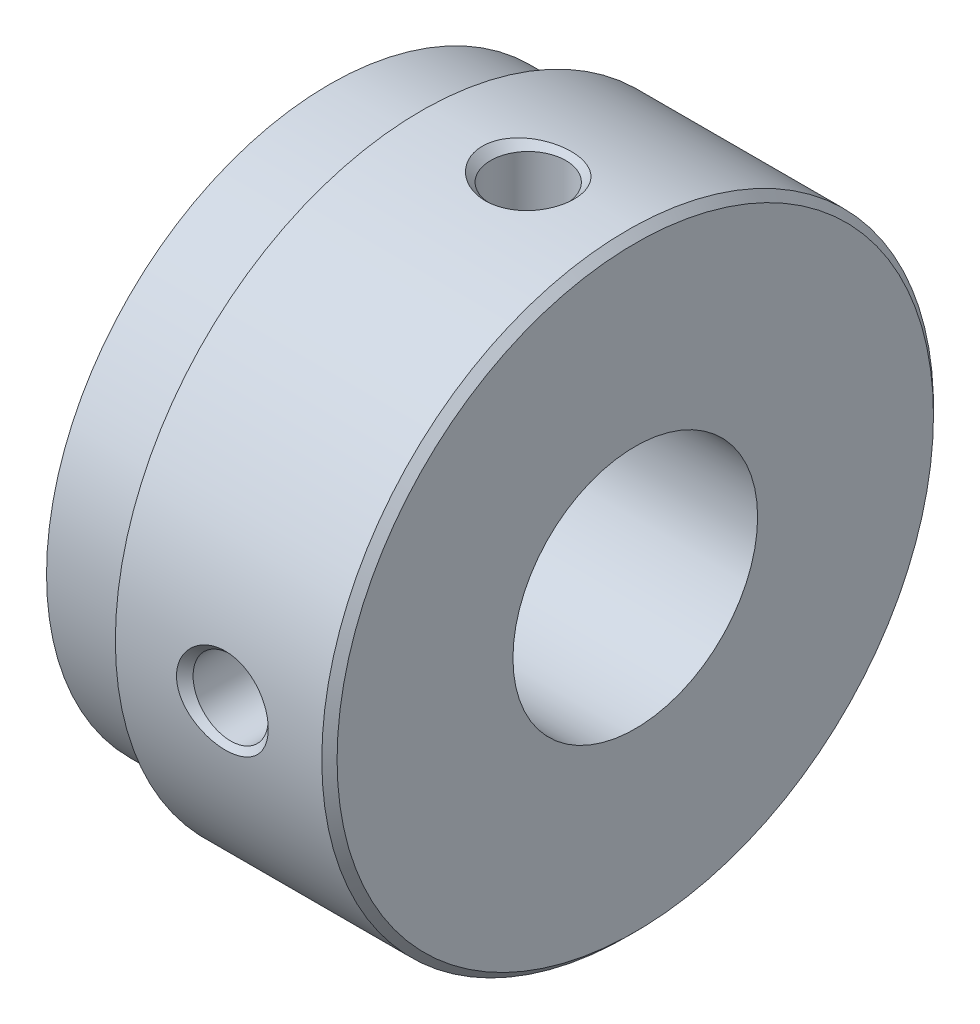
ISO-10303-21;
HEADER;
FILE_DESCRIPTION(('STEP AP214'),'2;1');
FILE_NAME('part.step','',(''),(''),'','','');
FILE_SCHEMA(('AUTOMOTIVE_DESIGN { 1 0 10303 214 1 1 1 1 }'));
ENDSEC;
DATA;
#1=APPLICATION_CONTEXT('core data for automotive mechanical design processes');
#2=APPLICATION_PROTOCOL_DEFINITION('international standard','automotive_design',2000,#1);
#3=PRODUCT_CONTEXT('',#1,'mechanical');
#4=PRODUCT('Part','Part','',(#3));
#5=PRODUCT_RELATED_PRODUCT_CATEGORY('part','',(#4));
#6=PRODUCT_DEFINITION_FORMATION('','',#4);
#7=PRODUCT_DEFINITION_CONTEXT('part definition',#1,'design');
#8=PRODUCT_DEFINITION('design','',#6,#7);
#9=PRODUCT_DEFINITION_SHAPE('','',#8);
#10=(LENGTH_UNIT() NAMED_UNIT(*) SI_UNIT(.MILLI.,.METRE.));
#11=(NAMED_UNIT(*) PLANE_ANGLE_UNIT() SI_UNIT($,.RADIAN.));
#12=(NAMED_UNIT(*) SI_UNIT($,.STERADIAN.) SOLID_ANGLE_UNIT());
#13=UNCERTAINTY_MEASURE_WITH_UNIT(LENGTH_MEASURE(1.E-05),#10,'distance_accuracy_value','');
#14=(GEOMETRIC_REPRESENTATION_CONTEXT(3) GLOBAL_UNCERTAINTY_ASSIGNED_CONTEXT((#13)) GLOBAL_UNIT_ASSIGNED_CONTEXT((#10,
#11,#12)) REPRESENTATION_CONTEXT('',''));
#15=CARTESIAN_POINT('',(0.,0.,0.));
#16=DIRECTION('',(0.,0.,1.));
#17=DIRECTION('',(1.,0.,0.));
#18=AXIS2_PLACEMENT_3D('',#15,#16,#17);
#19=CARTESIAN_POINT('',(10.,0.,0.));
#20=DIRECTION('',(-1.,0.,0.));
#21=DIRECTION('',(0.,0.,1.));
#22=AXIS2_PLACEMENT_3D('',#19,#20,#21);
#23=CYLINDRICAL_SURFACE('',#22,4.);
#24=CARTESIAN_POINT('',(6.5,3.80635386557792,1.2295));
#25=CARTESIAN_POINT('',(6.43271323239236,3.80635440377166,1.22949938123225));
#26=CARTESIAN_POINT('',(6.36542031464729,3.80815757951766,1.22395763503156));
#27=CARTESIAN_POINT('',(6.23280747245185,3.81514484838505,1.20199786549586));
#28=CARTESIAN_POINT('',(6.16748813886652,3.82032994371717,1.18557661806598));
#29=CARTESIAN_POINT('',(6.04076205874593,3.83343950391881,1.14247262095668));
#30=CARTESIAN_POINT('',(5.97934877390322,3.8413592403138,1.11580757495324));
#31=CARTESIAN_POINT('',(5.86185116370561,3.85903922881335,1.05303161137734));
#32=CARTESIAN_POINT('',(5.80576772313257,3.86879978570384,1.01691912920245));
#33=CARTESIAN_POINT('',(5.69865819722332,3.88942540794584,0.934988438857917));
#34=CARTESIAN_POINT('',(5.64783532464299,3.9003148865119,0.888910651065524));
#35=CARTESIAN_POINT('',(5.55450275612299,3.92176331399636,0.788913125243033));
#36=CARTESIAN_POINT('',(5.51199418211755,3.9323222181457,0.734992330584384));
#37=CARTESIAN_POINT('',(5.43560607734145,3.95219824311717,0.619385185071793));
#38=CARTESIAN_POINT('',(5.40193496235178,3.96148325867039,0.557555118317901));
#39=CARTESIAN_POINT('',(5.34554820014901,3.97748084921392,0.428775910367962));
#40=CARTESIAN_POINT('',(5.3228300662176,3.98419400803652,0.361827935122827));
#41=CARTESIAN_POINT('',(5.28967016798866,3.99411871846329,0.226840334671632));
#42=CARTESIAN_POINT('',(5.27888126864206,3.9974290749157,0.158893380249095));
#43=CARTESIAN_POINT('',(5.26878714934072,4.00052373745848,0.0220784762257139));
#44=CARTESIAN_POINT('',(5.26947940128591,4.00030881979912,-0.0467892672842548));
#45=CARTESIAN_POINT('',(5.28209764755671,3.99644637989037,-0.181050924962694));
#46=CARTESIAN_POINT('',(5.29364749538073,3.99291379749872,-0.246484022212031));
#47=CARTESIAN_POINT('',(5.32703702811,3.98295362475808,-0.374433736745107));
#48=CARTESIAN_POINT('',(5.348877376454,3.97652584775421,-0.436950165702716));
#49=CARTESIAN_POINT('',(5.40247499172922,3.96134131788031,-0.558170670261487));
#50=CARTESIAN_POINT('',(5.43434812099454,3.95255754189928,-0.616819992812417));
#51=CARTESIAN_POINT('',(5.5070141346346,3.93358906872065,-0.728056075315325));
#52=CARTESIAN_POINT('',(5.54780921773893,3.92340402642435,-0.78064133595022));
#53=CARTESIAN_POINT('',(5.63910047339345,3.9022341376536,-0.88050033075329));
#54=CARTESIAN_POINT('',(5.68992186795824,3.8912336022864,-0.927473827636568));
#55=CARTESIAN_POINT('',(5.79882539177789,3.87002942935048,-1.01231898478653));
#56=CARTESIAN_POINT('',(5.85690831827406,3.85982587948272,-1.0501896443192));
#57=CARTESIAN_POINT('',(5.97951041315458,3.8412935273282,-1.11608829704818));
#58=CARTESIAN_POINT('',(6.04409079136133,3.83298554801912,-1.14400869985746));
#59=CARTESIAN_POINT('',(6.17735267159558,3.81943036409521,-1.18848582775406));
#60=CARTESIAN_POINT('',(6.24603274783953,3.8141821021371,-1.20504647876849));
#61=CARTESIAN_POINT('',(6.38267579503357,3.80757419001524,-1.22576226435477));
#62=CARTESIAN_POINT('',(6.45056237935887,3.80607094811106,-1.2303757649399));
#63=CARTESIAN_POINT('',(6.58614320258701,3.80672527267106,-1.22835026711061));
#64=CARTESIAN_POINT('',(6.65383746854273,3.80888229582249,-1.22171293871722));
#65=CARTESIAN_POINT('',(6.78516432564088,3.81647268594629,-1.19778324722));
#66=CARTESIAN_POINT('',(6.84885747895183,3.82181369844603,-1.18079094178827));
#67=CARTESIAN_POINT('',(6.97248273449692,3.8350733158696,-1.13698412373119));
#68=CARTESIAN_POINT('',(7.03241423486999,3.84299233202402,-1.11016804397954));
#69=CARTESIAN_POINT('',(7.14866647121847,3.86079036704321,-1.04661954882951));
#70=CARTESIAN_POINT('',(7.20483964271837,3.87071794346317,-1.00963113234804));
#71=CARTESIAN_POINT('',(7.3103489424882,3.89131242534843,-0.927088917715112));
#72=CARTESIAN_POINT('',(7.3596833469315,3.90197951620805,-0.881532966767131));
#73=CARTESIAN_POINT('',(7.45214425026385,3.92336615463559,-0.780985836090425));
#74=CARTESIAN_POINT('',(7.49494452244066,3.93407081386551,-0.725690721742474));
#75=CARTESIAN_POINT('',(7.57066943109643,3.95389977469335,-0.608445701224589));
#76=CARTESIAN_POINT('',(7.60359453744173,3.96302415147332,-0.546496111869133));
#77=CARTESIAN_POINT('',(7.65831737203502,3.9786107236917,-0.418094896359459));
#78=CARTESIAN_POINT('',(7.68019689727253,3.9850924182426,-0.351680619103466));
#79=CARTESIAN_POINT('',(7.71240714402538,3.99474925320189,-0.215881627353963));
#80=CARTESIAN_POINT('',(7.72274135046739,3.9979253913647,-0.146497815776644));
#81=CARTESIAN_POINT('',(7.73129195631126,4.00054935844521,-0.00973711746519332));
#82=CARTESIAN_POINT('',(7.72998033661327,4.00014240818761,0.0576078302112272));
#83=CARTESIAN_POINT('',(7.71641247911107,3.99599145818272,0.19107508284201));
#84=CARTESIAN_POINT('',(7.70415691574044,3.99224766407244,0.257197462882263));
#85=CARTESIAN_POINT('',(7.66934619254148,3.98188776868326,0.385581324874175));
#86=CARTESIAN_POINT('',(7.64691384025773,3.97530596052373,0.447879064107083));
#87=CARTESIAN_POINT('',(7.59249675219719,3.95994947348842,0.567857712362305));
#88=CARTESIAN_POINT('',(7.56051040485213,3.95117442469751,0.625537840402735));
#89=CARTESIAN_POINT('',(7.48666609816315,3.93198797736763,0.73672281951534));
#90=CARTESIAN_POINT('',(7.44451613509549,3.92153198913756,0.790025966726974));
#91=CARTESIAN_POINT('',(7.35206055957934,3.90029687768218,0.888959792959537));
#92=CARTESIAN_POINT('',(7.30175254505362,3.88951766004865,0.934588204125905));
#93=CARTESIAN_POINT('',(7.19249393172044,3.86845172896833,1.0183360192836));
#94=CARTESIAN_POINT('',(7.1333196929467,3.85819150818664,1.05617110856373));
#95=CARTESIAN_POINT('',(7.00914780005064,3.83976607636001,1.1213157527686));
#96=CARTESIAN_POINT('',(6.94415270288511,3.8315999514627,1.14862990159779));
#97=CARTESIAN_POINT('',(6.81651596590316,3.81901415048645,1.18976874828432));
#98=CARTESIAN_POINT('',(6.75423362023426,3.81431307840504,1.204625343517));
#99=CARTESIAN_POINT('',(6.62796911143021,3.80798302793608,1.2244901483416));
#100=CARTESIAN_POINT('',(6.56398733660351,3.80635335377471,1.22950058842624));
#101=CARTESIAN_POINT('',(6.5,3.80635386557792,1.2295));
#102=B_SPLINE_CURVE_WITH_KNOTS('',3,(#24,#25,#26,#27,#28,#29,#30,#31,#32,#33,#34,#35,#36,#37,
#38,#39,#40,#41,#42,#43,#44,#45,#46,#47,#48,#49,#50,#51,#52,#53,#54,#55,#56,#57,#58,#59,#60,#61,
#62,#63,#64,#65,#66,#67,#68,#69,#70,#71,#72,#73,#74,#75,#76,#77,#78,#79,#80,#81,#82,#83,#84,#85,
#86,#87,#88,#89,#90,#91,#92,#93,#94,#95,#96,#97,#98,#99,#100,#101),.UNSPECIFIED.,.T.,.F.,(4,2,2,
2,2,2,2,2,2,2,2,2,2,2,2,2,2,2,2,2,2,2,2,2,2,2,2,2,2,2,2,2,2,2,2,2,2,2,4),(0.,0.201624072764265,
0.403307922725174,0.604644772641548,0.806014987351866,1.01345060448727,1.22091419377155,
1.43290248547726,1.64484262557061,1.85043834262087,2.05598878898116,2.25467080257231,
2.45336562714241,2.65444488101849,2.85557374489117,3.06482451305136,3.27409827499641,
3.48557073241779,3.69697006814369,3.9001297823435,4.10325934309527,4.30076552374331,
4.49830322506712,4.70135713713481,4.90446213965658,5.11567083988873,5.32686948908878,
5.53648030118367,5.74602782565074,5.94712284217638,6.14820546683679,6.34692356161492,
6.5456751951172,6.75101314533291,6.95641166591905,7.16832976260423,7.38015522136557,
7.57193603470341,7.76367339808171),.UNSPECIFIED.);
#103=CARTESIAN_POINT('',(6.5,3.80635386557792,1.2295));
#104=VERTEX_POINT('',#103);
#105=EDGE_CURVE('E53',#104,#104,#102,.T.);
#106=ORIENTED_EDGE('',*,*,#105,.F.);
#107=EDGE_LOOP('',(#106));
#108=FACE_BOUND('',#107,.T.);
#109=CARTESIAN_POINT('',(10.,0.,0.));
#110=DIRECTION('',(-1.,0.,0.));
#111=DIRECTION('',(0.,0.,1.));
#112=AXIS2_PLACEMENT_3D('',#109,#110,#111);
#113=CIRCLE('',#112,4.);
#114=CARTESIAN_POINT('',(10.,0.,4.));
#115=VERTEX_POINT('',#114);
#116=EDGE_CURVE('E83',#115,#115,#113,.T.);
#117=ORIENTED_EDGE('',*,*,#116,.F.);
#118=EDGE_LOOP('',(#117));
#119=FACE_BOUND('',#118,.T.);
#120=CARTESIAN_POINT('',(0.,0.,0.));
#121=DIRECTION('',(-1.,0.,0.));
#122=DIRECTION('',(0.,0.,1.));
#123=AXIS2_PLACEMENT_3D('',#120,#121,#122);
#124=CIRCLE('',#123,4.);
#125=CARTESIAN_POINT('',(0.,0.,4.));
#126=VERTEX_POINT('',#125);
#127=EDGE_CURVE('E46',#126,#126,#124,.T.);
#128=ORIENTED_EDGE('',*,*,#127,.T.);
#129=EDGE_LOOP('',(#128));
#130=FACE_BOUND('',#129,.T.);
#131=CARTESIAN_POINT('',(7.7295,0.,4.));
#132=CARTESIAN_POINT('',(7.72949939954456,-0.0673716579626826,3.99999955835788));
#133=CARTESIAN_POINT('',(7.72394416145855,-0.134749445220259,3.9982817457884));
#134=CARTESIAN_POINT('',(7.70192594555855,-0.267538045411364,3.99159715052677));
#135=CARTESIAN_POINT('',(7.68546017523352,-0.332948350293171,3.98662953606378));
#136=CARTESIAN_POINT('',(7.64222614132368,-0.459867781488426,3.97398869241967));
#137=CARTESIAN_POINT('',(7.61547351652615,-0.521382665351037,3.96631957173273));
#138=CARTESIAN_POINT('',(7.55249072429357,-0.639053481619476,3.94906973963879));
#139=CARTESIAN_POINT('',(7.51625915835266,-0.695208621588434,3.93948874620709));
#140=CARTESIAN_POINT('',(7.43420282806567,-0.802249980709256,3.91911291111394));
#141=CARTESIAN_POINT('',(7.3881453358382,-0.852952866719989,3.90829226875659));
#142=CARTESIAN_POINT('',(7.28824028356451,-0.946050261535372,3.88680797090776));
#143=CARTESIAN_POINT('',(7.23439133507526,-0.988443286339635,3.87614434377044));
#144=CARTESIAN_POINT('',(7.11885970390273,-1.06469947195573,3.85590621843129));
#145=CARTESIAN_POINT('',(7.05702116885899,-1.09833578560002,3.84636365505543));
#146=CARTESIAN_POINT('',(6.92822449548493,-1.15465599922972,3.82983514527024));
#147=CARTESIAN_POINT('',(6.86126766107713,-1.17734267801062,3.82284855031695));
#148=CARTESIAN_POINT('',(6.72619970294849,-1.21045282779686,3.81249248388624));
#149=CARTESIAN_POINT('',(6.65817959754641,-1.22121552219465,3.80902320825075));
#150=CARTESIAN_POINT('',(6.52121749082189,-1.23123176286355,3.80579801832533));
#151=CARTESIAN_POINT('',(6.45227573001357,-1.23048825538436,3.80604115344445));
#152=CARTESIAN_POINT('',(6.31821355097762,-1.21777898245511,3.81012506898962));
#153=CARTESIAN_POINT('',(6.2530476127829,-1.20624183781659,3.81382843468837));
#154=CARTESIAN_POINT('',(6.12562508870358,-1.17296672563312,3.82419268477022));
#155=CARTESIAN_POINT('',(6.06336880357951,-1.15122770610945,3.83085387414907));
#156=CARTESIAN_POINT('',(5.94250043973585,-1.09785787307329,3.84649033391308));
#157=CARTESIAN_POINT('',(5.88395285822811,-1.06609064363626,3.85549719804506));
#158=CARTESIAN_POINT('',(5.77287756202874,-0.993660914494449,3.87479539135672));
#159=CARTESIAN_POINT('',(5.72035137315482,-0.952996167723112,3.88508704472724));
#160=CARTESIAN_POINT('',(5.62038342532685,-0.86181190991578,3.90634897750116));
#161=CARTESIAN_POINT('',(5.57326666008553,-0.810937782669783,3.91732920142719));
#162=CARTESIAN_POINT('',(5.4881557833931,-0.701873526571223,3.9383313018227));
#163=CARTESIAN_POINT('',(5.45016230459176,-0.643682890785062,3.94835311180247));
#164=CARTESIAN_POINT('',(5.38416582889136,-0.521025912977826,3.96640863634104));
#165=CARTESIAN_POINT('',(5.35623809959635,-0.456516698593099,3.97442724050443));
#166=CARTESIAN_POINT('',(5.31172603244126,-0.323412601124873,3.98746388491106));
#167=CARTESIAN_POINT('',(5.29513836675011,-0.254818923088467,3.99248280538069));
#168=CARTESIAN_POINT('',(5.27432569542165,-0.118253395447415,3.99881394669196));
#169=CARTESIAN_POINT('',(5.26966052286586,-0.0503546438513211,4.00025807903481));
#170=CARTESIAN_POINT('',(5.27158725176091,0.0852615860011523,3.9996657647239));
#171=CARTESIAN_POINT('',(5.2781775678725,0.152979088441027,3.99762980824175));
#172=CARTESIAN_POINT('',(5.30207375671089,0.284627887423411,3.99039262772228));
#173=CARTESIAN_POINT('',(5.31911966956945,0.348610998029097,3.98526824422609));
#174=CARTESIAN_POINT('',(5.36312781687151,0.472792852878251,3.97245100912388));
#175=CARTESIAN_POINT('',(5.39009126337622,0.532991133509204,3.9647578435874));
#176=CARTESIAN_POINT('',(5.45389013528898,0.649492385419933,3.94736796463418));
#177=CARTESIAN_POINT('',(5.49094589648825,0.705668032859019,3.9376277994719));
#178=CARTESIAN_POINT('',(5.57361177922125,0.811152329129815,3.91725959579671));
#179=CARTESIAN_POINT('',(5.61922414860669,0.860459167555856,3.9066313243829));
#180=CARTESIAN_POINT('',(5.71977800202935,0.952762719049659,3.88517397398194));
#181=CARTESIAN_POINT('',(5.77500959831674,0.995445918125935,3.87435276470233));
#182=CARTESIAN_POINT('',(5.89208671006699,1.07096370944414,3.85416269764278));
#183=CARTESIAN_POINT('',(5.95393209011293,1.10379850327936,3.84479381013626));
#184=CARTESIAN_POINT('',(6.08232320543369,1.1584740817355,3.82867494404555));
#185=CARTESIAN_POINT('',(6.14884771169372,1.18036127536657,3.82191393855));
#186=CARTESIAN_POINT('',(6.28488688124068,1.21255002504933,3.81182535056983));
#187=CARTESIAN_POINT('',(6.35440044455265,1.22285580581934,3.80849651611947));
#188=CARTESIAN_POINT('',(6.49117561728857,1.23129241546655,3.80577670453651));
#189=CARTESIAN_POINT('',(6.55840268752859,1.22993619865975,3.8062198093075));
#190=CARTESIAN_POINT('',(6.69162193524369,1.21631985663361,3.81059260385625));
#191=CARTESIAN_POINT('',(6.75761416673789,1.2040602095386,3.81452214075109));
#192=CARTESIAN_POINT('',(6.88560590202065,1.16932339190046,3.8253110037048));
#193=CARTESIAN_POINT('',(6.9476477105295,1.14698845622866,3.83212946741825));
#194=CARTESIAN_POINT('',(7.06715295145954,1.09284649690115,3.84791866943941));
#195=CARTESIAN_POINT('',(7.12461547191157,1.06103759244214,3.85688983503974));
#196=CARTESIAN_POINT('',(7.23569492713232,0.987435690012729,3.87639917535535));
#197=CARTESIAN_POINT('',(7.28908263523463,0.945309119358837,3.88698395482643));
#198=CARTESIAN_POINT('',(7.38819730898562,0.852860224593202,3.90830866371101));
#199=CARTESIAN_POINT('',(7.4339222450959,0.80253573614401,3.91904863341214));
#200=CARTESIAN_POINT('',(7.51783977351225,0.693228424074377,3.93987573350866));
#201=CARTESIAN_POINT('',(7.55575265306839,0.634024345672143,3.94993201599572));
#202=CARTESIAN_POINT('',(7.62103563955843,0.50977359660812,3.96787868377842));
#203=CARTESIAN_POINT('',(7.64841022055521,0.444729419872155,3.97576998781168));
#204=CARTESIAN_POINT('',(7.68965734017316,0.316955879497068,3.98788965886747));
#205=CARTESIAN_POINT('',(7.70455636576249,0.254582678015558,3.99239239968192));
#206=CARTESIAN_POINT('',(7.72447705682376,0.128141285953877,3.99844750414587));
#207=CARTESIAN_POINT('',(7.72950057105958,0.0640734149039652,4.00000042002111));
#208=CARTESIAN_POINT('',(7.7295,0.,4.));
#209=B_SPLINE_CURVE_WITH_KNOTS('',3,(#131,#132,#133,#134,#135,#136,#137,#138,#139,#140,#141,
#142,#143,#144,#145,#146,#147,#148,#149,#150,#151,#152,#153,#154,#155,#156,#157,#158,#159,#160,
#161,#162,#163,#164,#165,#166,#167,#168,#169,#170,#171,#172,#173,#174,#175,#176,#177,#178,#179,
#180,#181,#182,#183,#184,#185,#186,#187,#188,#189,#190,#191,#192,#193,#194,#195,#196,#197,#198,
#199,#200,#201,#202,#203,#204,#205,#206,#207,#208),.UNSPECIFIED.,.T.,.F.,(4,2,2,2,2,2,2,2,2,2,2,
2,2,2,2,2,2,2,2,2,2,2,2,2,2,2,2,2,2,2,2,2,2,2,2,2,2,2,4),(0.,0.201879525901017,0.40381074210145,
0.605436174563531,0.80709137126984,1.01419454176839,1.22133466375555,1.43340125031888,
1.64541399034362,1.85122662875862,2.0569865681687,2.2549075373245,2.45284891982723,
2.6536082397256,2.85441831999998,3.0640555204706,3.27370725393367,3.48489565556978,
3.69602205567102,3.89923323667132,4.10241579767098,4.30074057116805,4.49908959078179,
4.70217446775051,4.90531277074848,5.11622136992566,5.32712565158549,5.53712812654055,
5.74705397098483,5.94779507409526,6.14852737497844,6.34651052234293,6.54453300019777,
6.75008318989609,6.95568773524265,7.1677109657345,7.37964408166247,7.57167635815772,
7.76367268146086),.UNSPECIFIED.);
#210=CARTESIAN_POINT('',(7.7295,0.,4.));
#211=VERTEX_POINT('',#210);
#212=EDGE_CURVE('E35',#211,#211,#209,.T.);
#213=ORIENTED_EDGE('',*,*,#212,.F.);
#214=EDGE_LOOP('',(#213));
#215=FACE_BOUND('',#214,.T.);
#216=ADVANCED_FACE('F31',(#108,#119,#130,#215),#23,.F.);
#217=CARTESIAN_POINT('',(10.,0.,0.));
#218=DIRECTION('',(-1.,0.,0.));
#219=DIRECTION('',(0.,0.,1.));
#220=AXIS2_PLACEMENT_3D('',#217,#218,#219);
#221=CYLINDRICAL_SURFACE('',#220,10.);
#222=CARTESIAN_POINT('',(5.47309598092249,9.94778605897726,-1.02056484066684));
#223=CARTESIAN_POINT('',(5.41933274174871,9.95263062959757,-0.973340626952614));
#224=CARTESIAN_POINT('',(5.36902661424539,9.95753953131423,-0.922181406902327));
#225=CARTESIAN_POINT('',(5.27662565081912,9.96706009525681,-0.812848771445586));
#226=CARTESIAN_POINT('',(5.2345336949472,9.97167165284989,-0.754672907391523));
#227=CARTESIAN_POINT('',(5.15522967404471,9.98069301364553,-0.624891570634612));
#228=CARTESIAN_POINT('',(5.1192566970551,9.98500805278512,-0.552514518495112));
#229=CARTESIAN_POINT('',(5.06085125917876,9.99218217713245,-0.402404602268414));
#230=CARTESIAN_POINT('',(5.03841734088679,9.99504141904358,-0.324672315646762));
#231=CARTESIAN_POINT('',(5.009120370477,9.99880546918665,-0.17142415711961));
#232=CARTESIAN_POINT('',(5.001355837066,9.99982325385633,-0.0960829045607142));
#233=CARTESIAN_POINT('',(4.99897088227158,10.000134132845,0.0547969127958129));
#234=CARTESIAN_POINT('',(5.00434653086858,9.99942774283726,0.130335411849987));
#235=CARTESIAN_POINT('',(5.02758668161371,9.99642846551868,0.276776806105327));
#236=CARTESIAN_POINT('',(5.04502016837426,9.99419035860618,0.347749982297543));
#237=CARTESIAN_POINT('',(5.09121522673089,9.98843015489408,0.485843093178219));
#238=CARTESIAN_POINT('',(5.11997771935117,9.98490795370207,0.552962714072337));
#239=CARTESIAN_POINT('',(5.18857725546589,9.97685185794294,0.683220021116521));
#240=CARTESIAN_POINT('',(5.22865759072913,9.97229622737974,0.746227853768973));
#241=CARTESIAN_POINT('',(5.31823056204534,9.96268863790012,0.865100302179757));
#242=CARTESIAN_POINT('',(5.36772558374495,9.95763655334128,0.920963101399767));
#243=CARTESIAN_POINT('',(5.47800834910569,9.94720566914986,1.02769470585994));
#244=CARTESIAN_POINT('',(5.53930814633682,9.94182616060481,1.07803411344928));
#245=CARTESIAN_POINT('',(5.66908660529599,9.93160448647937,1.16846412161937));
#246=CARTESIAN_POINT('',(5.73756740533769,9.92676248184212,1.20855165717286));
#247=CARTESIAN_POINT('',(5.88456810471373,9.91780649351088,1.28003995542236));
#248=CARTESIAN_POINT('',(5.96345152637075,9.91376066834328,1.31070282139145));
#249=CARTESIAN_POINT('',(6.12516640354918,9.90725115216845,1.35903319840312));
#250=CARTESIAN_POINT('',(6.20799872977308,9.90478781183612,1.3766978291936));
#251=CARTESIAN_POINT('',(6.37890494961808,9.9016403905718,1.39916284519962));
#252=CARTESIAN_POINT('',(6.46705425831568,9.90103371446979,1.40340383143447));
#253=CARTESIAN_POINT('',(6.64285047271134,9.90188801080786,1.39736234029168));
#254=CARTESIAN_POINT('',(6.73049731614676,9.90334923415803,1.38707810048534));
#255=CARTESIAN_POINT('',(6.9038597532638,9.90820255712822,1.35197568328223));
#256=CARTESIAN_POINT('',(6.98954060465311,9.91161711873527,1.32698833336983));
#257=CARTESIAN_POINT('',(7.15536040711243,9.91999349782495,1.26284184582618));
#258=CARTESIAN_POINT('',(7.23549926181121,9.92495534220541,1.22368246182751));
#259=CARTESIAN_POINT('',(7.38645384802164,9.93573853306013,1.13276392847506));
#260=CARTESIAN_POINT('',(7.45739996697199,9.94154459504111,1.08121996568244));
#261=CARTESIAN_POINT('',(7.58903213293499,9.95336401245668,0.966366786758812));
#262=CARTESIAN_POINT('',(7.64972084035577,9.95937731365215,0.903060630292881));
#263=CARTESIAN_POINT('',(7.75574670294296,9.97054543330341,0.769719002046591));
#264=CARTESIAN_POINT('',(7.80169676775728,9.97572806059188,0.700174131295821));
#265=CARTESIAN_POINT('',(7.88025527609634,9.98491910225308,0.553845352816648));
#266=CARTESIAN_POINT('',(7.91287096534173,9.98892815399377,0.477065404517991));
#267=CARTESIAN_POINT('',(7.96142833074595,9.99500831512589,0.324380237309349));
#268=CARTESIAN_POINT('',(7.97839616312123,9.99719757209399,0.248805586083637));
#269=CARTESIAN_POINT('',(7.99875360733173,9.99983293060129,0.095826220592244));
#270=CARTESIAN_POINT('',(8.00214809443108,10.0002796580196,0.0184221734579475));
#271=CARTESIAN_POINT('',(7.99538862806923,9.9993991606975,-0.131830773252804));
#272=CARTESIAN_POINT('',(7.98591227648304,9.99816065127932,-0.204711796646793));
#273=CARTESIAN_POINT('',(7.95499586976722,9.99420509136334,-0.34783866539022));
#274=CARTESIAN_POINT('',(7.93355601102558,9.9914880651363,-0.418084553976741));
#275=CARTESIAN_POINT('',(7.87943045108851,9.98485483820541,-0.55439905385746));
#276=CARTESIAN_POINT('',(7.84669308128532,9.9809331371962,-0.620446792297834));
#277=CARTESIAN_POINT('',(7.77116592021425,9.97230190263064,-0.746451685964574));
#278=CARTESIAN_POINT('',(7.72837404373032,9.96759220570929,-0.806407574095216));
#279=CARTESIAN_POINT('',(7.63157002993824,9.95758460968094,-0.921984288456231));
#280=CARTESIAN_POINT('',(7.57708180288081,9.95226874409907,-0.977204344572805));
#281=CARTESIAN_POINT('',(7.46010854860541,9.94181183598034,-1.07841183514694));
#282=CARTESIAN_POINT('',(7.39762110348151,9.93667084690019,-1.12439646719241));
#283=CARTESIAN_POINT('',(7.26184306181222,9.92673099287162,-1.20911507008739));
#284=CARTESIAN_POINT('',(7.18810621633623,9.92197942690465,-1.24713995860748));
#285=CARTESIAN_POINT('',(7.03547281470895,9.91374167164144,-1.31101728935736));
#286=CARTESIAN_POINT('',(6.95657504800434,9.91025578048892,-1.33686686398295));
#287=CARTESIAN_POINT('',(6.79156849385978,9.90477190699714,-1.37692741055618));
#288=CARTESIAN_POINT('',(6.70529692466913,9.90285834789982,-1.39048165934861));
#289=CARTESIAN_POINT('',(6.53166223912944,9.90103809639314,-1.40338405437722));
#290=CARTESIAN_POINT('',(6.44429884215032,9.90113193100181,-1.40272846998529));
#291=CARTESIAN_POINT('',(6.26901103637584,9.90334036608968,-1.38705236189585));
#292=CARTESIAN_POINT('',(6.1811143752986,9.90549800544836,-1.37172588419308));
#293=CARTESIAN_POINT('',(6.00921612620174,9.9116474983803,-1.32655951548342));
#294=CARTESIAN_POINT('',(5.92521279854378,9.91563852388053,-1.29672617633627));
#295=CARTESIAN_POINT('',(5.77710447986604,9.92419850731334,-1.22931992280682));
#296=CARTESIAN_POINT('',(5.71201581773421,9.92856044808351,-1.1938640963586));
#297=CARTESIAN_POINT('',(5.58775801788376,9.93785431221512,-1.11385438167189));
#298=CARTESIAN_POINT('',(5.5285856475203,9.94278592110124,-1.06930550277383));
#299=CARTESIAN_POINT('',(5.47309598092249,9.94778605897726,-1.02056484066684));
#300=B_SPLINE_CURVE_WITH_KNOTS('',3,(#222,#223,#224,#225,#226,#227,#228,#229,#230,#231,#232,
#233,#234,#235,#236,#237,#238,#239,#240,#241,#242,#243,#244,#245,#246,#247,#248,#249,#250,#251,
#252,#253,#254,#255,#256,#257,#258,#259,#260,#261,#262,#263,#264,#265,#266,#267,#268,#269,#270,
#271,#272,#273,#274,#275,#276,#277,#278,#279,#280,#281,#282,#283,#284,#285,#286,#287,#288,#289,
#290,#291,#292,#293,#294,#295,#296,#297,#298,#299),.UNSPECIFIED.,.T.,.F.,(4,2,2,2,2,2,2,2,2,2,2,
2,2,2,2,2,2,2,2,2,2,2,2,2,2,2,2,2,2,2,2,2,2,2,2,2,2,2,4),(0.,0.214966326771732,
0.430007890101767,0.671528523562845,0.913023154016268,1.13912228479122,1.3651538011845,
1.58349707886357,1.80185811105431,2.02532646765433,2.24885152592451,2.48632933131262,
2.72387805323661,2.97693381968733,3.23004564337048,3.49357519928465,3.7571367334931,
4.02379177089653,4.29045144406845,4.55277597826159,4.81503237003429,5.06425900680828,
5.31335003659822,5.54461645758207,5.77579980499822,5.99527228627884,6.21474116489584,
6.43522737564115,6.65575935370674,6.88803300147785,7.12037702460562,7.36857896378715,
7.61683933180778,7.87768998109054,8.13860911453727,8.40509088903825,8.67145242168922,
8.89344364226921,9.11531289690555),.UNSPECIFIED.);
#301=CARTESIAN_POINT('',(5.47309598092249,9.94778605897726,-1.02056484066684));
#302=VERTEX_POINT('',#301);
#303=EDGE_CURVE('E42',#302,#302,#300,.T.);
#304=ORIENTED_EDGE('',*,*,#303,.F.);
#305=EDGE_LOOP('',(#304));
#306=FACE_BOUND('',#305,.T.);
#307=CARTESIAN_POINT('',(3.,0.,0.));
#308=DIRECTION('',(-1.,0.,0.));
#309=DIRECTION('',(0.,0.,1.));
#310=AXIS2_PLACEMENT_3D('',#307,#308,#309);
#311=CIRCLE('',#310,10.);
#312=CARTESIAN_POINT('',(3.,0.,10.));
#313=VERTEX_POINT('',#312);
#314=EDGE_CURVE('E92',#313,#313,#311,.T.);
#315=ORIENTED_EDGE('',*,*,#314,.F.);
#316=EDGE_LOOP('',(#315));
#317=FACE_BOUND('',#316,.T.);
#318=CARTESIAN_POINT('',(9.75,0.,0.));
#319=DIRECTION('',(-1.,0.,0.));
#320=DIRECTION('',(0.,0.,1.));
#321=AXIS2_PLACEMENT_3D('',#318,#319,#320);
#322=CIRCLE('',#321,10.);
#323=CARTESIAN_POINT('',(9.75,0.,10.));
#324=VERTEX_POINT('',#323);
#325=EDGE_CURVE('E89',#324,#324,#322,.T.);
#326=ORIENTED_EDGE('',*,*,#325,.T.);
#327=EDGE_LOOP('',(#326));
#328=FACE_BOUND('',#327,.T.);
#329=CARTESIAN_POINT('',(5.47309598092249,-1.02056484066684,9.94778605897726));
#330=CARTESIAN_POINT('',(5.52677189981299,-1.06771089335917,9.94294942840246));
#331=CARTESIAN_POINT('',(5.58390702615604,-1.11094778487923,9.93817553298361));
#332=CARTESIAN_POINT('',(5.70377316178341,-1.18894327300194,9.92914691191021));
#333=CARTESIAN_POINT('',(5.76650920198875,-1.22369414039379,9.92489266130604));
#334=CARTESIAN_POINT('',(5.90822573249212,-1.28978618722003,9.91654003294524));
#335=CARTESIAN_POINT('',(5.98806808877336,-1.31931609277569,9.91261515062805));
#336=CARTESIAN_POINT('',(6.1515235236515,-1.36518676914151,9.90640209014056));
#337=CARTESIAN_POINT('',(6.23513807978498,-1.38152232364517,9.90411455932787));
#338=CARTESIAN_POINT('',(6.40702404318795,-1.40105103785563,9.90137169956546));
#339=CARTESIAN_POINT('',(6.49535401555038,-1.4037425937334,9.90098631354241));
#340=CARTESIAN_POINT('',(6.67124194834858,-1.39457112229023,9.90228211245317));
#341=CARTESIAN_POINT('',(6.75879985986009,-1.38270717919206,9.90396342741603));
#342=CARTESIAN_POINT('',(6.93158566294166,-1.34445590325839,9.90922868096571));
#343=CARTESIAN_POINT('',(7.01678019962788,-1.31792000797516,9.91283206831732));
#344=CARTESIAN_POINT('',(7.1813576650456,-1.25075181053787,9.92153016223691));
#345=CARTESIAN_POINT('',(7.2607404774742,-1.21011922637742,9.92662489863925));
#346=CARTESIAN_POINT('',(7.40980169710742,-1.11646880975357,9.93758888146771));
#347=CARTESIAN_POINT('',(7.47962845072467,-1.06368583877124,9.94344262163399));
#348=CARTESIAN_POINT('',(7.60879889259032,-0.946546817239137,9.95527504255324));
#349=CARTESIAN_POINT('',(7.66814553113953,-0.882194034083439,9.96125368761202));
#350=CARTESIAN_POINT('',(7.77126538344678,-0.747170462423031,9.97226544285642));
#351=CARTESIAN_POINT('',(7.81568294520043,-0.676995346107992,9.97733138142049));
#352=CARTESIAN_POINT('',(7.89108881618658,-0.529694365997959,9.98623292871275));
#353=CARTESIAN_POINT('',(7.92208445808913,-0.452572325342387,9.99006920893015));
#354=CARTESIAN_POINT('',(7.96749720575756,-0.299541966424279,9.99578469280565));
#355=CARTESIAN_POINT('',(7.98294353142297,-0.223943006114067,9.99778448351291));
#356=CARTESIAN_POINT('',(8.00031573617332,-0.0711887665172511,10.0000378290191));
#357=CARTESIAN_POINT('',(8.00224620921994,0.00596597502500881,10.0002919771516));
#358=CARTESIAN_POINT('',(7.99274441355196,0.155674676391254,9.99905514088515));
#359=CARTESIAN_POINT('',(7.98195226569821,0.228271032477151,9.99764774954664));
#360=CARTESIAN_POINT('',(7.9485071776854,0.37062347479786,9.99338337368427));
#361=CARTESIAN_POINT('',(7.92585424845514,0.440379563649696,9.9905263904961));
#362=CARTESIAN_POINT('',(7.86934799906529,0.575756296449203,9.98364363701556));
#363=CARTESIAN_POINT('',(7.83540884523839,0.641340512753831,9.97960893967128));
#364=CARTESIAN_POINT('',(7.75758098306333,0.766245882863769,9.97079708485493));
#365=CARTESIAN_POINT('',(7.71369012756347,0.825565681021115,9.96601976722721));
#366=CARTESIAN_POINT('',(7.61467000928403,0.939786002613441,9.95591646847456));
#367=CARTESIAN_POINT('',(7.5590553180537,0.99426387688874,9.95057476193367));
#368=CARTESIAN_POINT('',(7.43995549940169,1.09382042721509,9.94012416857133));
#369=CARTESIAN_POINT('',(7.3764680038295,1.13889626413134,9.93501535243873));
#370=CARTESIAN_POINT('',(7.23878720919834,1.22157305173364,9.92520098407249));
#371=CARTESIAN_POINT('',(7.16415947802128,1.25845725544318,9.92054647889027));
#372=CARTESIAN_POINT('',(7.00993009002748,1.31991261402395,9.912557383597));
#373=CARTESIAN_POINT('',(6.93032719480048,1.34448068934416,9.90922312364664));
#374=CARTESIAN_POINT('',(6.76420436658163,1.3817629297155,9.90409555697605));
#375=CARTESIAN_POINT('',(6.67753686423134,1.39383349837598,9.90238625583926));
#376=CARTESIAN_POINT('',(6.50337237536275,1.4037015784585,9.90099218067399));
#377=CARTESIAN_POINT('',(6.41587526918642,1.4014969986422,9.90130770327208));
#378=CARTESIAN_POINT('',(6.2407340445864,1.38266941758889,9.90395466364509));
#379=CARTESIAN_POINT('',(6.15312052302622,1.3657652504054,9.90632540991842));
#380=CARTESIAN_POINT('',(5.98202992422492,1.31748792667808,9.91286106158821));
#381=CARTESIAN_POINT('',(5.89855307277067,1.28611398130905,9.91702606479841));
#382=CARTESIAN_POINT('',(5.7389182453035,1.20984735519183,9.92661717935074));
#383=CARTESIAN_POINT('',(5.66270638803093,1.16506641167099,9.93203278568373));
#384=CARTESIAN_POINT('',(5.51932704442388,1.06285289716208,9.94348923411007));
#385=CARTESIAN_POINT('',(5.45215811855596,1.0054223436964,9.94952997641733));
#386=CARTESIAN_POINT('',(5.33181156579094,0.881832972269918,9.96122778236008));
#387=CARTESIAN_POINT('',(5.2781804010869,0.81611727429324,9.96689051211509));
#388=CARTESIAN_POINT('',(5.18366713749368,0.676013652616076,9.9773704498836));
#389=CARTESIAN_POINT('',(5.14277866466726,0.60163009027573,9.98218808008986));
#390=CARTESIAN_POINT('',(5.07791843803368,0.451798285099306,9.99005058902722));
#391=CARTESIAN_POINT('',(5.05297646011848,0.376775279306869,9.99319461896867));
#392=CARTESIAN_POINT('',(5.01687494790828,0.223440781734967,9.99779686958387));
#393=CARTESIAN_POINT('',(5.00570892826063,0.14513085531808,9.99925588349741));
#394=CARTESIAN_POINT('',(4.99792542919406,-0.00738737987815392,10.0002703358382));
#395=CARTESIAN_POINT('',(5.00045798716817,-0.0815528135264977,9.99993699342222));
#396=CARTESIAN_POINT('',(5.01800767242676,-0.228367062059618,9.99766160418204));
#397=CARTESIAN_POINT('',(5.03302502781802,-0.301015849209244,9.99571952796508));
#398=CARTESIAN_POINT('',(5.07466886446324,-0.441909074229982,9.9904772848621));
#399=CARTESIAN_POINT('',(5.10115832950815,-0.510194901821544,9.987193171832));
#400=CARTESIAN_POINT('',(5.16471618123962,-0.641550155036951,9.97961637115688));
#401=CARTESIAN_POINT('',(5.20178034143964,-0.704621651757158,9.97532408657805));
#402=CARTESIAN_POINT('',(5.2764111742133,-0.811538605732789,9.96712846198348));
#403=CARTESIAN_POINT('',(5.31222292912137,-0.856633321286905,9.96333404169556));
#404=CARTESIAN_POINT('',(5.38897642131528,-0.942182805912471,9.95560821289304));
#405=CARTESIAN_POINT('',(5.42991693401377,-0.982638678193192,9.95167683724033));
#406=CARTESIAN_POINT('',(5.47309598092249,-1.02056484066684,9.94778605897726));
#407=B_SPLINE_CURVE_WITH_KNOTS('',3,(#329,#330,#331,#332,#333,#334,#335,#336,#337,#338,#339,
#340,#341,#342,#343,#344,#345,#346,#347,#348,#349,#350,#351,#352,#353,#354,#355,#356,#357,#358,
#359,#360,#361,#362,#363,#364,#365,#366,#367,#368,#369,#370,#371,#372,#373,#374,#375,#376,#377,
#378,#379,#380,#381,#382,#383,#384,#385,#386,#387,#388,#389,#390,#391,#392,#393,#394,#395,#396,
#397,#398,#399,#400,#401,#402,#403,#404,#405,#406),.UNSPECIFIED.,.T.,.F.,(4,2,2,2,2,2,2,2,2,2,2,
2,2,2,2,2,2,2,2,2,2,2,2,2,2,2,2,2,2,2,2,2,2,2,2,2,2,2,4),(0.,0.21465905634132,0.429512904490815,
0.683997468820186,0.938582592898337,1.20246262031695,1.46635925092564,1.7329782709335,
1.99960262500292,2.26145158187301,2.52322670663229,2.77152819336333,3.01969385622997,
3.25006841260005,3.48036466216149,3.69955151506824,3.91873816601145,4.13963141805556,
4.3605723748462,4.59366804475225,4.826834001019,5.07585565435746,5.32493954258294,
5.58629430067807,5.84768734681319,6.11419296884649,6.38071312124799,6.64507109692022,
6.90938693987636,7.16308850416264,7.41666296163241,7.65279381026765,7.88881345234477,
8.11036337957971,8.33191735478976,8.55089519688156,8.76978564037918,8.94250709670723,
9.11518739086394),.UNSPECIFIED.);
#408=CARTESIAN_POINT('',(5.47309598092249,-1.02056484066684,9.94778605897726));
#409=VERTEX_POINT('',#408);
#410=EDGE_CURVE('E10',#409,#409,#407,.T.);
#411=ORIENTED_EDGE('',*,*,#410,.F.);
#412=EDGE_LOOP('',(#411));
#413=FACE_BOUND('',#412,.T.);
#414=ADVANCED_FACE('F57',(#306,#317,#328,#413),#221,.T.);
#415=CARTESIAN_POINT('',(0.,9.25,0.));
#416=DIRECTION('',(1.,0.,0.));
#417=DIRECTION('',(0.,0.,-1.));
#418=AXIS2_PLACEMENT_3D('',#415,#416,#417);
#419=PLANE('',#418);
#420=ORIENTED_EDGE('',*,*,#127,.F.);
#421=EDGE_LOOP('',(#420));
#422=FACE_BOUND('',#421,.T.);
#423=CARTESIAN_POINT('',(0.,0.,0.));
#424=DIRECTION('',(-1.,0.,0.));
#425=DIRECTION('',(0.,0.,1.));
#426=AXIS2_PLACEMENT_3D('',#423,#424,#425);
#427=CIRCLE('',#426,9.25);
#428=CARTESIAN_POINT('',(0.,0.,9.25));
#429=VERTEX_POINT('',#428);
#430=EDGE_CURVE('E98',#429,#429,#427,.T.);
#431=ORIENTED_EDGE('',*,*,#430,.T.);
#432=EDGE_LOOP('',(#431));
#433=FACE_BOUND('',#432,.T.);
#434=ADVANCED_FACE('F33',(#422,#433),#419,.F.);
#435=CARTESIAN_POINT('',(10.,4.,0.));
#436=DIRECTION('',(-1.,0.,0.));
#437=DIRECTION('',(0.,0.,1.));
#438=AXIS2_PLACEMENT_3D('',#435,#436,#437);
#439=PLANE('',#438);
#440=CARTESIAN_POINT('',(10.,0.,0.));
#441=DIRECTION('',(-1.,0.,0.));
#442=DIRECTION('',(0.,0.,1.));
#443=AXIS2_PLACEMENT_3D('',#440,#441,#442);
#444=CIRCLE('',#443,9.75);
#445=CARTESIAN_POINT('',(10.,0.,9.75));
#446=VERTEX_POINT('',#445);
#447=EDGE_CURVE('E86',#446,#446,#444,.T.);
#448=ORIENTED_EDGE('',*,*,#447,.F.);
#449=EDGE_LOOP('',(#448));
#450=FACE_BOUND('',#449,.T.);
#451=ORIENTED_EDGE('',*,*,#116,.T.);
#452=EDGE_LOOP('',(#451));
#453=FACE_BOUND('',#452,.T.);
#454=ADVANCED_FACE('F122',(#450,#453),#439,.F.);
#455=CARTESIAN_POINT('',(10.,0.,0.));
#456=DIRECTION('',(-1.,0.,0.));
#457=DIRECTION('',(0.,0.,1.));
#458=AXIS2_PLACEMENT_3D('',#455,#456,#457);
#459=CONICAL_SURFACE('',#458,9.75,0.785398163397448);
#460=ORIENTED_EDGE('',*,*,#325,.F.);
#461=EDGE_LOOP('',(#460));
#462=FACE_BOUND('',#461,.T.);
#463=ORIENTED_EDGE('',*,*,#447,.T.);
#464=EDGE_LOOP('',(#463));
#465=FACE_BOUND('',#464,.T.);
#466=ADVANCED_FACE('F125',(#462,#465),#459,.T.);
#467=CARTESIAN_POINT('',(3.,10.,0.));
#468=DIRECTION('',(1.,0.,0.));
#469=DIRECTION('',(0.,0.,-1.));
#470=AXIS2_PLACEMENT_3D('',#467,#468,#469);
#471=PLANE('',#470);
#472=CARTESIAN_POINT('',(3.,0.,0.));
#473=DIRECTION('',(-1.,0.,0.));
#474=DIRECTION('',(0.,0.,1.));
#475=AXIS2_PLACEMENT_3D('',#472,#473,#474);
#476=CIRCLE('',#475,9.25);
#477=CARTESIAN_POINT('',(3.,0.,9.25));
#478=VERTEX_POINT('',#477);
#479=EDGE_CURVE('E95',#478,#478,#476,.T.);
#480=ORIENTED_EDGE('',*,*,#479,.F.);
#481=EDGE_LOOP('',(#480));
#482=FACE_BOUND('',#481,.T.);
#483=ORIENTED_EDGE('',*,*,#314,.T.);
#484=EDGE_LOOP('',(#483));
#485=FACE_BOUND('',#484,.T.);
#486=ADVANCED_FACE('F128',(#482,#485),#471,.F.);
#487=CARTESIAN_POINT('',(10.,0.,0.));
#488=DIRECTION('',(-1.,0.,0.));
#489=DIRECTION('',(0.,0.,1.));
#490=AXIS2_PLACEMENT_3D('',#487,#488,#489);
#491=CYLINDRICAL_SURFACE('',#490,9.25);
#492=ORIENTED_EDGE('',*,*,#430,.F.);
#493=EDGE_LOOP('',(#492));
#494=FACE_BOUND('',#493,.T.);
#495=ORIENTED_EDGE('',*,*,#479,.T.);
#496=EDGE_LOOP('',(#495));
#497=FACE_BOUND('',#496,.T.);
#498=ADVANCED_FACE('F72',(#494,#497),#491,.T.);
#499=CARTESIAN_POINT('',(6.5,0.,0.));
#500=DIRECTION('',(0.,1.,0.));
#501=DIRECTION('',(0.,0.,1.));
#502=AXIS2_PLACEMENT_3D('',#499,#500,#501);
#503=CYLINDRICAL_SURFACE('',#502,1.2295);
#504=CARTESIAN_POINT('',(6.5,9.7295,0.));
#505=DIRECTION('',(0.,1.,0.));
#506=DIRECTION('',(0.,0.,1.));
#507=AXIS2_PLACEMENT_3D('',#504,#505,#506);
#508=CIRCLE('',#507,1.2295);
#509=CARTESIAN_POINT('',(6.5,9.7295,1.2295));
#510=VERTEX_POINT('',#509);
#511=EDGE_CURVE('E101',#510,#510,#508,.T.);
#512=ORIENTED_EDGE('',*,*,#511,.T.);
#513=EDGE_LOOP('',(#512));
#514=FACE_BOUND('',#513,.T.);
#515=ORIENTED_EDGE('',*,*,#105,.T.);
#516=EDGE_LOOP('',(#515));
#517=FACE_BOUND('',#516,.T.);
#518=ADVANCED_FACE('F67',(#514,#517),#503,.F.);
#519=CARTESIAN_POINT('',(6.5,9.7295,0.));
#520=DIRECTION('',(0.,1.,0.));
#521=DIRECTION('',(0.,0.,1.));
#522=AXIS2_PLACEMENT_3D('',#519,#520,#521);
#523=CONICAL_SURFACE('',#522,1.2295,0.785398163397449);
#524=ORIENTED_EDGE('',*,*,#511,.F.);
#525=EDGE_LOOP('',(#524));
#526=FACE_BOUND('',#525,.T.);
#527=ORIENTED_EDGE('',*,*,#303,.T.);
#528=EDGE_LOOP('',(#527));
#529=FACE_BOUND('',#528,.T.);
#530=ADVANCED_FACE('F71',(#526,#529),#523,.F.);
#531=CARTESIAN_POINT('',(6.5,0.,0.));
#532=DIRECTION('',(0.,0.,1.));
#533=DIRECTION('',(0.,-1.,0.));
#534=AXIS2_PLACEMENT_3D('',#531,#532,#533);
#535=CYLINDRICAL_SURFACE('',#534,1.2295);
#536=CARTESIAN_POINT('',(6.5,0.,9.7295));
#537=DIRECTION('',(0.,0.,1.));
#538=DIRECTION('',(0.,-1.,0.));
#539=AXIS2_PLACEMENT_3D('',#536,#537,#538);
#540=CIRCLE('',#539,1.2295);
#541=CARTESIAN_POINT('',(6.5,-1.2295,9.7295));
#542=VERTEX_POINT('',#541);
#543=EDGE_CURVE('E104',#542,#542,#540,.T.);
#544=ORIENTED_EDGE('',*,*,#543,.T.);
#545=EDGE_LOOP('',(#544));
#546=FACE_BOUND('',#545,.T.);
#547=ORIENTED_EDGE('',*,*,#212,.T.);
#548=EDGE_LOOP('',(#547));
#549=FACE_BOUND('',#548,.T.);
#550=ADVANCED_FACE('F64',(#546,#549),#535,.F.);
#551=CARTESIAN_POINT('',(6.5,0.,9.7295));
#552=DIRECTION('',(0.,0.,1.));
#553=DIRECTION('',(0.,-1.,0.));
#554=AXIS2_PLACEMENT_3D('',#551,#552,#553);
#555=CONICAL_SURFACE('',#554,1.2295,0.785398163397449);
#556=ORIENTED_EDGE('',*,*,#543,.F.);
#557=EDGE_LOOP('',(#556));
#558=FACE_BOUND('',#557,.T.);
#559=ORIENTED_EDGE('',*,*,#410,.T.);
#560=EDGE_LOOP('',(#559));
#561=FACE_BOUND('',#560,.T.);
#562=ADVANCED_FACE('F61',(#558,#561),#555,.F.);
#563=CLOSED_SHELL('',(#216,#414,#434,#454,#466,#486,#498,#518,#530,#550,#562));
#564=MANIFOLD_SOLID_BREP('B2',#563);
#565=ADVANCED_BREP_SHAPE_REPRESENTATION('',(#18,#564),#14);
#566=SHAPE_DEFINITION_REPRESENTATION(#9,#565);
ENDSEC;
END-ISO-10303-21;
